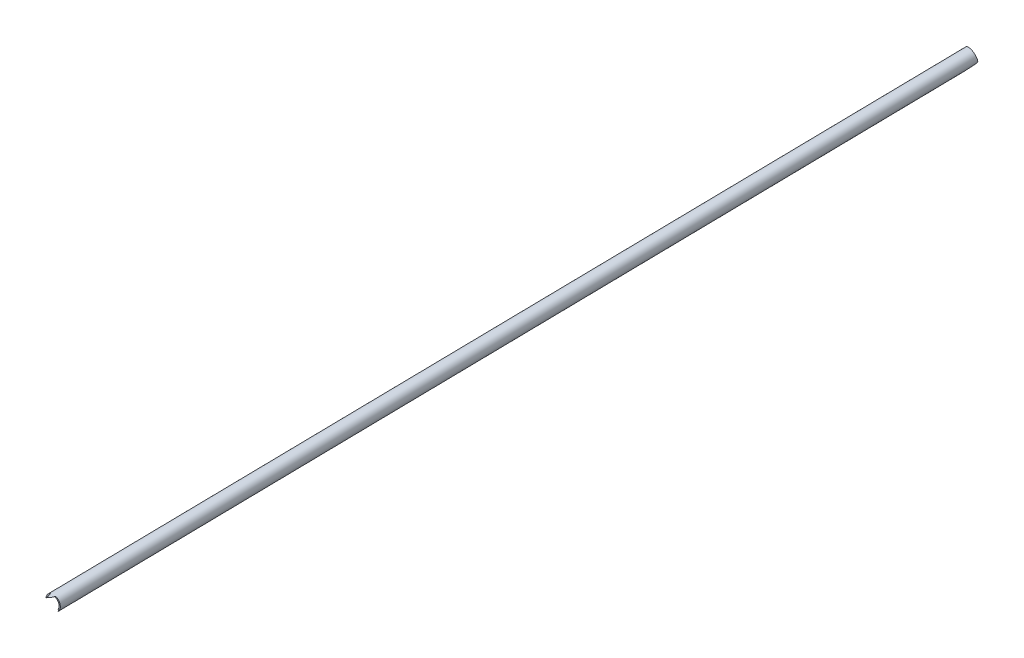
ISO-10303-21;
HEADER;
FILE_DESCRIPTION(('STEP AP214'),'2;1');
FILE_NAME('part.step','',(''),(''),'','','');
FILE_SCHEMA(('AUTOMOTIVE_DESIGN { 1 0 10303 214 1 1 1 1 }'));
ENDSEC;
DATA;
#1=APPLICATION_CONTEXT('core data for automotive mechanical design processes');
#2=APPLICATION_PROTOCOL_DEFINITION('international standard','automotive_design',2000,#1);
#3=PRODUCT_CONTEXT('',#1,'mechanical');
#4=PRODUCT('Part','Part','',(#3));
#5=PRODUCT_RELATED_PRODUCT_CATEGORY('part','',(#4));
#6=PRODUCT_DEFINITION_FORMATION('','',#4);
#7=PRODUCT_DEFINITION_CONTEXT('part definition',#1,'design');
#8=PRODUCT_DEFINITION('design','',#6,#7);
#9=PRODUCT_DEFINITION_SHAPE('','',#8);
#10=(LENGTH_UNIT() NAMED_UNIT(*) SI_UNIT(.MILLI.,.METRE.));
#11=(NAMED_UNIT(*) PLANE_ANGLE_UNIT() SI_UNIT($,.RADIAN.));
#12=(NAMED_UNIT(*) SI_UNIT($,.STERADIAN.) SOLID_ANGLE_UNIT());
#13=UNCERTAINTY_MEASURE_WITH_UNIT(LENGTH_MEASURE(1.E-05),#10,'distance_accuracy_value','');
#14=(GEOMETRIC_REPRESENTATION_CONTEXT(3) GLOBAL_UNCERTAINTY_ASSIGNED_CONTEXT((#13)) GLOBAL_UNIT_ASSIGNED_CONTEXT((#10,
#11,#12)) REPRESENTATION_CONTEXT('',''));
#15=CARTESIAN_POINT('',(0.,0.,0.));
#16=DIRECTION('',(0.,0.,1.));
#17=DIRECTION('',(1.,0.,0.));
#18=AXIS2_PLACEMENT_3D('',#15,#16,#17);
#19=CARTESIAN_POINT('',(325.000000000001,320.,-1580.));
#20=DIRECTION('',(-0.0876619818920292,-0.105194378270435,0.99058039537993));
#21=DIRECTION('',(0.,-0.994408591727349,-0.105600912395825));
#22=AXIS2_PLACEMENT_3D('',#19,#20,#21);
#23=CYLINDRICAL_SURFACE('',#22,7.90000000000002);
#24=CARTESIAN_POINT('',(320.543654947566,306.796558062433,-1530.47754811542));
#25=CARTESIAN_POINT('',(320.488560814158,306.78590810331,-1530.37724688731));
#26=CARTESIAN_POINT('',(320.432764836307,306.77569579562,-1530.27728618767));
#27=CARTESIAN_POINT('',(320.319611164136,306.756248486853,-1530.07814393779));
#28=CARTESIAN_POINT('',(320.262253346996,306.747013562916,-1529.97896244963));
#29=CARTESIAN_POINT('',(320.145784884711,306.729628618284,-1529.78145112065));
#30=CARTESIAN_POINT('',(320.086673163378,306.721479281268,-1529.68312185264));
#31=CARTESIAN_POINT('',(319.966535754802,306.706414140928,-1529.48754429941));
#32=CARTESIAN_POINT('',(319.905510059538,306.699498342775,-1529.39029601873));
#33=CARTESIAN_POINT('',(319.719131630831,306.680834515334,-1529.10030826867));
#34=CARTESIAN_POINT('',(319.590564060701,306.67118353378,-1528.90947424502));
#35=CARTESIAN_POINT('',(319.322561499345,306.659336820871,-1528.5354107769));
#36=CARTESIAN_POINT('',(319.183136461121,306.65713434192,-1528.35217459828));
#37=CARTESIAN_POINT('',(318.96231811265,306.661828444225,-1528.0855588565));
#38=CARTESIAN_POINT('',(318.886345451769,306.664762060353,-1527.99763113501));
#39=CARTESIAN_POINT('',(318.730038087019,306.673991290724,-1527.82595427125));
#40=CARTESIAN_POINT('',(318.649705458901,306.680285317495,-1527.74220317633));
#41=CARTESIAN_POINT('',(318.484307027052,306.697031789688,-1527.58073048478));
#42=CARTESIAN_POINT('',(318.399266260407,306.707463772164,-1527.50298143402));
#43=CARTESIAN_POINT('',(318.223385477481,306.733606206748,-1527.35542462552));
#44=CARTESIAN_POINT('',(318.132554688965,306.749308421845,-1527.2856047016));
#45=CARTESIAN_POINT('',(317.962727321103,306.783757854901,-1527.16984584105));
#46=CARTESIAN_POINT('',(317.884874256616,306.801315252798,-1527.1219046383));
#47=CARTESIAN_POINT('',(317.724966180843,306.841721435934,-1527.03606223227));
#48=CARTESIAN_POINT('',(317.642911007424,306.86457042546,-1526.99816141673));
#49=CARTESIAN_POINT('',(317.474376773763,306.916677734025,-1526.93537934093));
#50=CARTESIAN_POINT('',(317.387853598366,306.946016719098,-1526.91067664911));
#51=CARTESIAN_POINT('',(317.214004180144,307.011013407202,-1526.87864219122));
#52=CARTESIAN_POINT('',(317.126680072444,307.046657342355,-1526.87127306589));
#53=CARTESIAN_POINT('',(316.964656291022,307.118829003525,-1526.87517586683));
#54=CARTESIAN_POINT('',(316.8896518111,307.154793348757,-1526.88441961201));
#55=CARTESIAN_POINT('',(316.744145695094,307.229518976841,-1526.91677961783));
#56=CARTESIAN_POINT('',(316.673649342141,307.268283431899,-1526.93991183642));
#57=CARTESIAN_POINT('',(316.519831995844,307.358162526483,-1527.00580274504));
#58=CARTESIAN_POINT('',(316.438368817278,307.409723417656,-1527.05222334784));
#59=CARTESIAN_POINT('',(316.285243570785,307.513250041039,-1527.15869709257));
#60=CARTESIAN_POINT('',(316.213604036682,307.565216424283,-1527.2187807637));
#61=CARTESIAN_POINT('',(316.086120195484,307.663155638223,-1527.34157670375));
#62=CARTESIAN_POINT('',(316.029407847472,307.709188683477,-1527.40336245114));
#63=CARTESIAN_POINT('',(315.921961502537,307.800550542093,-1527.53246308941));
#64=CARTESIAN_POINT('',(315.871232794217,307.845878702183,-1527.59978278358));
#65=CARTESIAN_POINT('',(315.774761862884,307.935814084267,-1527.73863585102));
#66=CARTESIAN_POINT('',(315.729032323723,307.980419238579,-1527.81017926415));
#67=CARTESIAN_POINT('',(315.641939560466,308.068777951366,-1527.95630687704));
#68=CARTESIAN_POINT('',(315.600574671958,308.112531829237,-1528.03088990254));
#69=CARTESIAN_POINT('',(315.497018737229,308.226151480722,-1528.22942327576));
#70=CARTESIAN_POINT('',(315.437825316874,308.295379158148,-1528.35529865463));
#71=CARTESIAN_POINT('',(315.327042693628,308.432023324735,-1528.61134037376));
#72=CARTESIAN_POINT('',(315.27545795926,308.499438730707,-1528.74150918104));
#73=CARTESIAN_POINT('',(315.178370398651,308.632790738265,-1529.00515956286));
#74=CARTESIAN_POINT('',(315.132879199624,308.698724318415,-1529.13864691025));
#75=CARTESIAN_POINT('',(315.047016508993,308.829194212562,-1529.40794105953));
#76=CARTESIAN_POINT('',(315.006645929395,308.893730275963,-1529.54374826973));
#77=CARTESIAN_POINT('',(314.891545295395,309.086197957968,-1529.95528975568));
#78=CARTESIAN_POINT('',(314.823327453029,309.212278654763,-1530.23371871038));
#79=CARTESIAN_POINT('',(314.730668913138,309.398396406435,-1530.65448403082));
#80=CARTESIAN_POINT('',(314.701409082201,309.45989833005,-1530.79517226639));
#81=CARTESIAN_POINT('',(314.645730994337,309.582033744066,-1531.07748507398));
#82=CARTESIAN_POINT('',(314.61931265223,309.642667260453,-1531.21910961779));
#83=CARTESIAN_POINT('',(314.535788546614,309.842601054816,-1531.69038306624));
#84=CARTESIAN_POINT('',(314.484151237813,309.980209219403,-1532.02172145251));
#85=CARTESIAN_POINT('',(314.391395419461,310.25211594129,-1532.68723863866));
#86=CARTESIAN_POINT('',(314.350278752578,310.3864139151,-1533.02141792554));
#87=CARTESIAN_POINT('',(314.276617125279,310.652355453141,-1533.69197465544));
#88=CARTESIAN_POINT('',(314.244076889045,310.783997517698,-1534.02835320578));
#89=CARTESIAN_POINT('',(314.186204367685,311.04501088905,-1534.70261725784));
#90=CARTESIAN_POINT('',(314.160872463331,311.174382075549,-1535.04050283822));
#91=CARTESIAN_POINT('',(314.11633738783,311.431513169356,-1535.71823087393));
#92=CARTESIAN_POINT('',(314.09714932194,311.559268374798,-1536.05807609242));
#93=CARTESIAN_POINT('',(314.064205806617,311.813128624322,-1536.73864831384));
#94=CARTESIAN_POINT('',(314.050450487851,311.939233628644,-1537.07937533778));
#95=CARTESIAN_POINT('',(314.016392669596,312.315343498669,-1538.10233518503));
#96=CARTESIAN_POINT('',(314.003283353838,312.563234730297,-1538.78558922638));
#97=CARTESIAN_POINT('',(313.9927484289,313.054759676075,-1540.15351922354));
#98=CARTESIAN_POINT('',(313.99531899029,313.298394415194,-1540.83819479136));
#99=CARTESIAN_POINT('',(314.013889159413,313.782598791793,-1542.20849789611));
#100=CARTESIAN_POINT('',(314.029889815062,314.023168188606,-1542.89412550316));
#101=CARTESIAN_POINT('',(314.073766790044,314.501841018603,-1544.26483357784));
#102=CARTESIAN_POINT('',(314.101627377186,314.739947292057,-1544.94991357005));
#103=CARTESIAN_POINT('',(314.168222616848,315.214859084776,-1546.31997107985));
#104=CARTESIAN_POINT('',(314.206956959824,315.451664640873,-1547.0049485998));
#105=CARTESIAN_POINT('',(314.284231365412,315.8683254895,-1548.2108874612));
#106=CARTESIAN_POINT('',(314.320609089683,316.048276902748,-1548.73195570596));
#107=CARTESIAN_POINT('',(314.39920153601,316.408304079174,-1549.7736090704));
#108=CARTESIAN_POINT('',(314.441416252634,316.588379842236,-1550.29419419052));
#109=CARTESIAN_POINT('',(314.531687306014,316.949141882681,-1551.33485938459));
#110=CARTESIAN_POINT('',(314.579745759492,317.129828358099,-1551.85493920634));
#111=CARTESIAN_POINT('',(314.681807012639,317.492219550017,-1552.89415968668));
#112=CARTESIAN_POINT('',(314.735809796608,317.673924263827,-1553.41330034775));
#113=CARTESIAN_POINT('',(314.849934668098,318.038630486234,-1554.44958378193));
#114=CARTESIAN_POINT('',(314.910047602183,318.221629683825,-1554.96672837322));
#115=CARTESIAN_POINT('',(315.036894450987,318.589835459905,-1555.99941595813));
#116=CARTESIAN_POINT('',(315.103628309615,318.775042019682,-1556.5149589653));
#117=CARTESIAN_POINT('',(315.244370796393,319.148408306645,-1557.54385252987));
#118=CARTESIAN_POINT('',(315.318377798014,319.336567365675,-1558.0572035508));
#119=CARTESIAN_POINT('',(315.474665115471,319.716843990279,-1559.08116255843));
#120=CARTESIAN_POINT('',(315.55694515178,319.908961421933,-1559.59177063719));
#121=CARTESIAN_POINT('',(315.730728841968,320.297270781887,-1560.60645441873));
#122=CARTESIAN_POINT('',(315.822177183444,320.493433203887,-1561.11055077089));
#123=CARTESIAN_POINT('',(316.016789343097,320.89242962909,-1562.11392573019));
#124=CARTESIAN_POINT('',(316.119954814866,321.095264571082,-1562.6132036465));
#125=CARTESIAN_POINT('',(316.341173052316,321.50968872199,-1563.60539780196));
#126=CARTESIAN_POINT('',(316.459238487067,321.721285276585,-1564.09830822912));
#127=CARTESIAN_POINT('',(316.651011995122,322.046864303911,-1564.83012627012));
#128=CARTESIAN_POINT('',(316.717375533344,322.156744074798,-1565.07278545712));
#129=CARTESIAN_POINT('',(316.855843203145,322.379574395132,-1565.55502883536));
#130=CARTESIAN_POINT('',(316.927947011535,322.492524771462,-1565.79461319883));
#131=CARTESIAN_POINT('',(317.098149289079,322.75108769904,-1566.33065265765));
#132=CARTESIAN_POINT('',(317.198187223599,322.897683065161,-1566.62602704167));
#133=CARTESIAN_POINT('',(317.411410729602,323.196832795408,-1567.20887615008));
#134=CARTESIAN_POINT('',(317.524593047775,323.349385678836,-1567.49635280752));
#135=CARTESIAN_POINT('',(317.767257292476,323.660608189947,-1568.06037322411));
#136=CARTESIAN_POINT('',(317.896714172772,323.819268164031,-1568.33693294272));
#137=CARTESIAN_POINT('',(318.176182644987,324.142634735303,-1568.87577884827));
#138=CARTESIAN_POINT('',(318.326182817154,324.307337936159,-1569.13807285294));
#139=CARTESIAN_POINT('',(318.592904342085,324.580991636479,-1569.55229016032));
#140=CARTESIAN_POINT('',(318.702123260868,324.688631581438,-1569.70990863895));
#141=CARTESIAN_POINT('',(318.932234960658,324.904821484434,-1570.01567971377));
#142=CARTESIAN_POINT('',(319.053123503814,325.013371099144,-1570.16383571404));
#143=CARTESIAN_POINT('',(319.307603390287,325.229932490588,-1570.44887036527));
#144=CARTESIAN_POINT('',(319.441178883807,325.337944765522,-1570.58576269887));
#145=CARTESIAN_POINT('',(319.721978163475,325.551667920021,-1570.84682058821));
#146=CARTESIAN_POINT('',(319.869201442168,325.657378884974,-1570.97098661678));
#147=CARTESIAN_POINT('',(320.179554564179,325.865419780353,-1571.20671306965));
#148=CARTESIAN_POINT('',(320.342863933022,325.967689092507,-1571.3180917435));
#149=CARTESIAN_POINT('',(320.683331622106,326.164532669489,-1571.52548402261));
#150=CARTESIAN_POINT('',(320.860490035775,326.259106882398,-1571.6214975242));
#151=CARTESIAN_POINT('',(321.227480589281,326.437629035614,-1571.79801253723));
#152=CARTESIAN_POINT('',(321.41731431635,326.521575641282,-1571.87851210106));
#153=CARTESIAN_POINT('',(321.807833492552,326.676125782724,-1572.02458045477));
#154=CARTESIAN_POINT('',(322.008517951737,326.746730533086,-1572.09015060387));
#155=CARTESIAN_POINT('',(322.386852999763,326.862669615387,-1572.19849017533));
#156=CARTESIAN_POINT('',(322.56327262817,326.910222812339,-1572.24321708883));
#157=CARTESIAN_POINT('',(322.920904422984,326.993187165938,-1572.32379372898));
#158=CARTESIAN_POINT('',(323.102115961647,327.028599904592,-1572.35964461209));
#159=CARTESIAN_POINT('',(323.467984258053,327.086543094326,-1572.42347648955));
#160=CARTESIAN_POINT('',(323.652641768979,327.109070694233,-1572.4514557414));
#161=CARTESIAN_POINT('',(324.024012262607,327.140733670167,-1572.5005199512));
#162=CARTESIAN_POINT('',(324.210725359054,327.149868301306,-1572.52160452564));
#163=CARTESIAN_POINT('',(324.589494766305,327.154507921747,-1572.55823049584));
#164=CARTESIAN_POINT('',(324.781569606189,327.149672377419,-1572.57362290236));
#165=CARTESIAN_POINT('',(325.16515932435,327.12550881736,-1572.59897571592));
#166=CARTESIAN_POINT('',(325.356674201621,327.106180775596,-1572.6089361132));
#167=CARTESIAN_POINT('',(325.737887405151,327.053060098952,-1572.624133528));
#168=CARTESIAN_POINT('',(325.927585605462,327.019266468507,-1572.62937022035));
#169=CARTESIAN_POINT('',(326.303940551276,326.937372486669,-1572.63567184936));
#170=CARTESIAN_POINT('',(326.490597186519,326.889271617835,-1572.63673663513));
#171=CARTESIAN_POINT('',(326.870441484906,326.7758216514,-1572.63504248807));
#172=CARTESIAN_POINT('',(327.063377657455,326.709632138098,-1572.63205757823));
#173=CARTESIAN_POINT('',(327.443209242765,326.561968799258,-1572.62213821247));
#174=CARTESIAN_POINT('',(327.630104423664,326.480494387873,-1572.61520360514));
#175=CARTESIAN_POINT('',(327.996613299343,326.302796984137,-1572.59746464312));
#176=CARTESIAN_POINT('',(328.176225221308,326.206570427899,-1572.58665935248));
#177=CARTESIAN_POINT('',(328.52687960532,326.000058800123,-1572.56106677425));
#178=CARTESIAN_POINT('',(328.697922057972,325.889773713172,-1572.5462794823));
#179=CARTESIAN_POINT('',(329.033019298696,325.653990813228,-1572.51213164114));
#180=CARTESIAN_POINT('',(329.196909833362,325.528269834622,-1572.49269888839));
#181=CARTESIAN_POINT('',(329.513395759784,325.264107705259,-1572.44886527564));
#182=CARTESIAN_POINT('',(329.665990933439,325.125666309,-1572.42446431975));
#183=CARTESIAN_POINT('',(329.95873851075,324.837227209316,-1572.36995252232));
#184=CARTESIAN_POINT('',(330.098891013491,324.687229597933,-1572.33984172625));
#185=CARTESIAN_POINT('',(330.365689534809,324.37704507744,-1572.27297052797));
#186=CARTESIAN_POINT('',(330.492335937472,324.21685845829,-1572.23621031495));
#187=CARTESIAN_POINT('',(330.728620674935,323.891427890684,-1572.15580204699));
#188=CARTESIAN_POINT('',(330.838565266961,323.726365819843,-1572.11231843372));
#189=CARTESIAN_POINT('',(331.043893895243,323.389782103441,-1572.01677769331));
#190=CARTESIAN_POINT('',(331.139278215232,323.218260583835,-1571.96472073328));
#191=CARTESIAN_POINT('',(331.314908555404,322.870940096549,-1571.85092985606));
#192=CARTESIAN_POINT('',(331.395168440676,322.695145215004,-1571.78920489786));
#193=CARTESIAN_POINT('',(331.540469365751,322.341385035346,-1571.65500545517));
#194=CARTESIAN_POINT('',(331.605511508222,322.163419895473,-1571.58253175016));
#195=CARTESIAN_POINT('',(331.716864457431,321.819239570251,-1571.43113807847));
#196=CARTESIAN_POINT('',(331.764115801131,321.653010117936,-1571.35293993579));
#197=CARTESIAN_POINT('',(331.846026585465,321.322689603453,-1571.18616576613));
#198=CARTESIAN_POINT('',(331.880687053074,321.158598367934,-1571.09759058633));
#199=CARTESIAN_POINT('',(331.938274419082,320.834337141683,-1570.91013105344));
#200=CARTESIAN_POINT('',(331.961202933524,320.67416661378,-1570.81124812248));
#201=CARTESIAN_POINT('',(331.996468023562,320.359166396229,-1570.60359301724));
#202=CARTESIAN_POINT('',(332.008803192386,320.204337418547,-1570.49481953164));
#203=CARTESIAN_POINT('',(332.026580168547,319.853677307344,-1570.23265802394));
#204=CARTESIAN_POINT('',(332.028663350103,319.660152421696,-1570.07595012022));
#205=CARTESIAN_POINT('',(332.019860436871,319.285377779221,-1569.7488435511));
#206=CARTESIAN_POINT('',(332.008969454362,319.104132675716,-1569.57843974864));
#207=CARTESIAN_POINT('',(331.977009511533,318.753748866412,-1569.22591533437));
#208=CARTESIAN_POINT('',(331.955920319097,318.584634996766,-1569.04377205797));
#209=CARTESIAN_POINT('',(331.905947739692,318.258333609715,-1568.67023761511));
#210=CARTESIAN_POINT('',(331.877065228041,318.101144755474,-1568.47884748921));
#211=CARTESIAN_POINT('',(331.804740912746,317.756316507011,-1568.03546753412));
#212=CARTESIAN_POINT('',(331.759476202483,317.57204190672,-1567.78116853163));
#213=CARTESIAN_POINT('',(331.662268536929,317.218669089389,-1567.2633948974));
#214=CARTESIAN_POINT('',(331.610322261505,317.049578488845,-1566.99991575175));
#215=CARTESIAN_POINT('',(331.5016037673,316.724034537327,-1566.46555987426));
#216=CARTESIAN_POINT('',(331.444822346884,316.567606439091,-1566.19466973475));
#217=CARTESIAN_POINT('',(331.327849916855,316.265743150107,-1565.64765165932));
#218=CARTESIAN_POINT('',(331.267659455125,316.12030620164,-1565.37152456977));
#219=CARTESIAN_POINT('',(331.144113473533,315.837245164978,-1564.81233723308));
#220=CARTESIAN_POINT('',(331.080731942574,315.699715842018,-1564.52923500289));
#221=CARTESIAN_POINT('',(330.951981411081,315.432635518018,-1563.95974292152));
#222=CARTESIAN_POINT('',(330.886612344831,315.303084781212,-1563.67335296182));
#223=CARTESIAN_POINT('',(330.754391561077,315.050971942088,-1563.09840729203));
#224=CARTESIAN_POINT('',(330.68754226103,314.928399466186,-1562.80985555868));
#225=CARTESIAN_POINT('',(330.552532438082,314.68907356205,-1562.23067494421));
#226=CARTESIAN_POINT('',(330.484371967602,314.572319901844,-1561.94004614644));
#227=CARTESIAN_POINT('',(330.3400029885,314.33235488977,-1561.32779207901));
#228=CARTESIAN_POINT('',(330.263674195375,314.209674098626,-1561.00598759943));
#229=CARTESIAN_POINT('',(330.109779921367,313.96955503906,-1560.36071989023));
#230=CARTESIAN_POINT('',(330.032214409086,313.852116904027,-1560.03725661865));
#231=CARTESIAN_POINT('',(329.797780844003,313.506581698846,-1559.06479110977));
#232=CARTESIAN_POINT('',(329.639192095848,313.285290583662,-1558.41378240259));
#233=CARTESIAN_POINT('',(329.317573028748,312.856699910225,-1557.10787740288));
#234=CARTESIAN_POINT('',(329.154540248071,312.649408337429,-1556.45297911956));
#235=CARTESIAN_POINT('',(328.823977591398,312.246281498985,-1555.14078558311));
#236=CARTESIAN_POINT('',(328.656447601909,312.050446522856,-1554.48349026985));
#237=CARTESIAN_POINT('',(328.315681840023,311.667399978086,-1553.16386188555));
#238=CARTESIAN_POINT('',(328.142420523519,311.480239640035,-1552.50152058244));
#239=CARTESIAN_POINT('',(327.790587930462,311.11440391,-1551.17589676297));
#240=CARTESIAN_POINT('',(327.612016571257,310.935728650197,-1550.51261423213));
#241=CARTESIAN_POINT('',(327.24912182341,310.586166314009,-1549.18608746083));
#242=CARTESIAN_POINT('',(327.06480242843,310.415274024641,-1548.52284350099));
#243=CARTESIAN_POINT('',(326.689602770863,310.080666135584,-1547.19640938043));
#244=CARTESIAN_POINT('',(326.498722592983,309.916950443298,-1546.53321921912));
#245=CARTESIAN_POINT('',(326.112142909169,309.598631220125,-1545.21619227871));
#246=CARTESIAN_POINT('',(325.916541949598,309.44393512934,-1544.56234898694));
#247=CARTESIAN_POINT('',(325.517085303219,309.141384361079,-1543.25560394804));
#248=CARTESIAN_POINT('',(325.313229700178,308.993529614211,-1542.60270219144));
#249=CARTESIAN_POINT('',(324.895597184618,308.704745580556,-1541.2973088359));
#250=CARTESIAN_POINT('',(324.681804677592,308.563827946617,-1540.64481963046));
#251=CARTESIAN_POINT('',(324.242856048083,308.289846050513,-1539.34208588844));
#252=CARTESIAN_POINT('',(324.01770111563,308.156780969074,-1538.69184112437));
#253=CARTESIAN_POINT('',(323.555416801601,307.900609630553,-1537.39964551038));
#254=CARTESIAN_POINT('',(323.318397074067,307.777432496547,-1536.75766985088));
#255=CARTESIAN_POINT('',(322.949959410174,307.600612580567,-1535.79802894267));
#256=CARTESIAN_POINT('',(322.824964579778,307.542984282258,-1535.47862764204));
#257=CARTESIAN_POINT('',(322.570057789211,307.430734297433,-1534.84126598101));
#258=CARTESIAN_POINT('',(322.440145972318,307.376112523423,-1534.52330557892));
#259=CARTESIAN_POINT('',(322.174972374082,307.270448905713,-1533.89000029845));
#260=CARTESIAN_POINT('',(322.03972518513,307.219398230627,-1533.57465080073));
#261=CARTESIAN_POINT('',(321.762567033753,307.121321147878,-1532.9462740703));
#262=CARTESIAN_POINT('',(321.62065652734,307.074294465447,-1532.63324668038));
#263=CARTESIAN_POINT('',(321.328904987743,306.985129111191,-1532.01047547831));
#264=CARTESIAN_POINT('',(321.179069812119,306.942986900531,-1531.70072943853));
#265=CARTESIAN_POINT('',(320.869499851362,306.864757293392,-1531.08547377847));
#266=CARTESIAN_POINT('',(320.709767505267,306.828668413207,-1530.77996313696));
#267=CARTESIAN_POINT('',(320.543654947566,306.796558062433,-1530.47754811542));
#268=B_SPLINE_CURVE_WITH_KNOTS('',3,(#24,#25,#26,#27,#28,#29,#30,#31,#32,#33,#34,#35,#36,#37,
#38,#39,#40,#41,#42,#43,#44,#45,#46,#47,#48,#49,#50,#51,#52,#53,#54,#55,#56,#57,#58,#59,#60,#61,
#62,#63,#64,#65,#66,#67,#68,#69,#70,#71,#72,#73,#74,#75,#76,#77,#78,#79,#80,#81,#82,#83,#84,#85,
#86,#87,#88,#89,#90,#91,#92,#93,#94,#95,#96,#97,#98,#99,#100,#101,#102,#103,#104,#105,#106,#107,
#108,#109,#110,#111,#112,#113,#114,#115,#116,#117,#118,#119,#120,#121,#122,#123,#124,#125,#126,
#127,#128,#129,#130,#131,#132,#133,#134,#135,#136,#137,#138,#139,#140,#141,#142,#143,#144,#145,
#146,#147,#148,#149,#150,#151,#152,#153,#154,#155,#156,#157,#158,#159,#160,#161,#162,#163,#164,
#165,#166,#167,#168,#169,#170,#171,#172,#173,#174,#175,#176,#177,#178,#179,#180,#181,#182,#183,
#184,#185,#186,#187,#188,#189,#190,#191,#192,#193,#194,#195,#196,#197,#198,#199,#200,#201,#202,
#203,#204,#205,#206,#207,#208,#209,#210,#211,#212,#213,#214,#215,#216,#217,#218,#219,#220,#221,
#222,#223,#224,#225,#226,#227,#228,#229,#230,#231,#232,#233,#234,#235,#236,#237,#238,#239,#240,
#241,#242,#243,#244,#245,#246,#247,#248,#249,#250,#251,#252,#253,#254,#255,#256,#257,#258,#259,
#260,#261,#262,#263,#264,#265,#266,#267),.UNSPECIFIED.,.T.,.F.,(4,2,2,2,2,2,2,2,2,2,2,2,2,2,2,2,
2,2,2,2,2,2,2,2,2,2,2,2,2,2,2,2,2,2,2,2,2,2,2,2,2,2,2,2,2,2,2,2,2,2,2,2,2,2,2,2,2,2,2,2,2,2,2,2,
2,2,2,2,2,2,2,2,2,2,2,2,2,2,2,2,2,2,2,2,2,2,2,2,2,2,2,2,2,2,2,2,2,2,2,2,2,2,2,2,2,2,2,2,2,2,2,2,
2,2,2,2,2,2,2,2,2,4),(0.,0.344786037196059,0.68959926628695,1.03462863438675,1.37965944854352,
2.07023732650786,2.76018944226897,3.10875559039596,3.45715721997359,3.80385700053645,
4.1500174170313,4.42871553035893,4.70742440494515,4.98981435328882,5.27159510328553,
5.52127161457787,5.7712355565361,6.09045023472007,6.41038530946563,6.69697776967708,
6.98382166437584,7.27137722580638,7.5588227317163,8.02457103273437,8.49059178432291,
8.95748946467793,9.42447018517034,10.3634303084531,10.8323359117984,11.3012274546858,
12.3883892785765,13.4757413863737,14.5636911977893,15.6516984681382,16.7423605341283,
17.8330488311457,20.013647016733,22.1937126654252,24.3739484346918,26.5513010908421,
28.7285917705539,30.3859585744859,32.0433238359269,33.7012912275468,35.3592542399097,
37.0147691227241,38.6702699815901,40.3254014517192,41.9804770172512,43.6261081461517,
45.2719718055067,46.9192444514816,47.7427275502677,48.5661643178254,49.5996250378272,
50.63283051331,51.6644649371858,52.6955281990019,53.3548189598258,54.0138711919972,
54.6721106375321,55.3303256181177,55.9969680585236,56.6636149965681,57.3303455708245,
57.9970154193452,58.5606966612961,59.1243044227266,59.6880368488399,60.2518006273163,
60.8294216435613,61.4070436973591,61.9847055112377,62.5623882195554,63.1736671706393,
63.784969555897,64.3964198556425,65.0078708257705,65.6295261596348,66.2511934938689,
66.8728558772225,67.4945005770861,68.1028268640392,68.7111412952017,69.3188953214791,
69.926605296632,70.4949438664378,71.0632360692623,71.6314499702943,72.1997393170915,
72.9456130132245,73.6917677892008,74.439408964543,75.1869662024976,76.1381015512328,
77.0897113675864,78.0431744708114,78.9964847708386,79.9595137771316,80.922574659917,
81.8841643618192,82.845715698175,83.9039208940497,84.9621529983167,87.0788450919644,
89.1967345414745,91.3146774891243,93.4438505868775,95.5730568425781,97.7008153410094,
99.8285463782435,101.927831625065,104.027095574103,106.129773249581,108.23223115875,
110.317943875784,111.361291333139,112.404608411405,113.445246778113,114.48581403104,
115.525622609655,116.565175951449),.UNSPECIFIED.);
#269=CARTESIAN_POINT('',(320.543654947566,306.796558062433,-1530.47754811542));
#270=VERTEX_POINT('',#269);
#271=EDGE_CURVE('E122',#270,#270,#268,.T.);
#272=ORIENTED_EDGE('',*,*,#271,.T.);
#273=EDGE_LOOP('',(#272));
#274=FACE_BOUND('',#273,.T.);
#275=CARTESIAN_POINT('',(227.132676253428,194.703383629466,-474.933488871653));
#276=CARTESIAN_POINT('',(227.258458717553,194.686329876106,-474.77290976023));
#277=CARTESIAN_POINT('',(227.37959929058,194.672554963167,-474.608358444933));
#278=CARTESIAN_POINT('',(227.613822176292,194.650561283138,-474.273217818518));
#279=CARTESIAN_POINT('',(227.726901185122,194.642344782463,-474.102626074243));
#280=CARTESIAN_POINT('',(227.94612274839,194.630700236803,-473.756570001234));
#281=CARTESIAN_POINT('',(228.052255280463,194.62727897125,-473.581099130928));
#282=CARTESIAN_POINT('',(228.25827316125,194.624648176384,-473.226476699128));
#283=CARTESIAN_POINT('',(228.358157439982,194.625439366447,-473.047324514167));
#284=CARTESIAN_POINT('',(228.552887204009,194.630782077004,-472.68513037813));
#285=CARTESIAN_POINT('',(228.647702830305,194.635353718736,-472.502072730865));
#286=CARTESIAN_POINT('',(228.832315210354,194.647914782998,-472.133552286181));
#287=CARTESIAN_POINT('',(228.922111511709,194.655904513046,-471.948089273813));
#288=CARTESIAN_POINT('',(229.18456854676,194.68452898913,-471.389137467985));
#289=CARTESIAN_POINT('',(229.350494665127,194.709825800467,-471.012712990457));
#290=CARTESIAN_POINT('',(229.679068940281,194.77345654576,-470.2269240051));
#291=CARTESIAN_POINT('',(229.840592455818,194.812607766643,-469.817161745957));
#292=CARTESIAN_POINT('',(230.14940325783,194.902225247805,-468.993466111648));
#293=CARTESIAN_POINT('',(230.296687563272,194.952693870115,-468.579531883007));
#294=CARTESIAN_POINT('',(230.579329666679,195.06454939242,-467.748382136189));
#295=CARTESIAN_POINT('',(230.714668912048,195.125952844679,-467.33116257309));
#296=CARTESIAN_POINT('',(230.974829682494,195.259702132825,-466.495257062945));
#297=CARTESIAN_POINT('',(231.099652227896,195.332046905286,-466.076571262268));
#298=CARTESIAN_POINT('',(231.33977094657,195.488092153472,-465.240025342462));
#299=CARTESIAN_POINT('',(231.45509530315,195.571756932034,-464.822166657306));
#300=CARTESIAN_POINT('',(231.677755608385,195.751932925387,-463.98702002658));
#301=CARTESIAN_POINT('',(231.785090425866,195.848445953883,-463.569732170009));
#302=CARTESIAN_POINT('',(231.992496001758,196.056317368734,-462.737734763409));
#303=CARTESIAN_POINT('',(232.092577892093,196.16765222765,-462.323022195491));
#304=CARTESIAN_POINT('',(232.237853615255,196.348446922002,-461.703916344414));
#305=CARTESIAN_POINT('',(232.285465667792,196.411002353265,-461.498065694961));
#306=CARTESIAN_POINT('',(232.379123804523,196.541330159838,-461.087668365834));
#307=CARTESIAN_POINT('',(232.425169959384,196.609102299274,-460.883121627656));
#308=CARTESIAN_POINT('',(232.528986830824,196.771325668643,-460.416019521788));
#309=CARTESIAN_POINT('',(232.586237926673,196.86777407725,-460.154035465103));
#310=CARTESIAN_POINT('',(232.698062784299,197.072637435985,-459.634091979816));
#311=CARTESIAN_POINT('',(232.75263594168,197.18105506972,-459.376133468637));
#312=CARTESIAN_POINT('',(232.858631037939,197.412232736203,-458.866569916755));
#313=CARTESIAN_POINT('',(232.910058381286,197.53496705427,-458.614954442642));
#314=CARTESIAN_POINT('',(233.009049134101,197.79812361458,-458.120343638508));
#315=CARTESIAN_POINT('',(233.056614412111,197.938537218345,-457.877344172339));
#316=CARTESIAN_POINT('',(233.130407339524,198.187205815407,-457.487741895955));
#317=CARTESIAN_POINT('',(233.158226393069,198.289241114459,-457.337475132726));
#318=CARTESIAN_POINT('',(233.210893157937,198.503174689762,-457.043615806582));
#319=CARTESIAN_POINT('',(233.23574194909,198.615069355817,-456.90002082984));
#320=CARTESIAN_POINT('',(233.281522687657,198.849336024458,-456.621335136889));
#321=CARTESIAN_POINT('',(233.302461015814,198.971690475532,-456.486230809743));
#322=CARTESIAN_POINT('',(233.339297712061,199.227407723235,-456.226078025968));
#323=CARTESIAN_POINT('',(233.355196365429,199.360769896219,-456.101029000444));
#324=CARTESIAN_POINT('',(233.380750562594,199.640134271899,-455.861113184994));
#325=CARTESIAN_POINT('',(233.390318975223,199.786282744242,-455.746406547208));
#326=CARTESIAN_POINT('',(233.401354467267,200.088567473371,-455.530535077926));
#327=CARTESIAN_POINT('',(233.402821753109,200.244703475557,-455.429369901437));
#328=CARTESIAN_POINT('',(233.396255300233,200.565205446913,-455.241256773237));
#329=CARTESIAN_POINT('',(233.388217838015,200.729574617276,-455.154314408526));
#330=CARTESIAN_POINT('',(233.361513825507,201.064193622415,-454.994557072427));
#331=CARTESIAN_POINT('',(233.342847366288,201.234443406794,-454.921741980003));
#332=CARTESIAN_POINT('',(233.297872981354,201.552007711166,-454.799506927473));
#333=CARTESIAN_POINT('',(233.273174709298,201.698838196219,-454.748211750103));
#334=CARTESIAN_POINT('',(233.215348310462,201.99365359305,-454.654268591797));
#335=CARTESIAN_POINT('',(233.182217099651,202.141638907931,-454.611623784684));
#336=CARTESIAN_POINT('',(233.107396408212,202.437513659359,-454.534053992346));
#337=CARTESIAN_POINT('',(233.065703818354,202.585403041438,-454.499131821342));
#338=CARTESIAN_POINT('',(232.973775745671,202.879910669333,-454.436064418599));
#339=CARTESIAN_POINT('',(232.923542286126,203.026529207579,-454.40791758563));
#340=CARTESIAN_POINT('',(232.806598762137,203.338975486293,-454.353753795021));
#341=CARTESIAN_POINT('',(232.738552456944,203.504463220986,-454.328656183946));
#342=CARTESIAN_POINT('',(232.59152755269,203.831372740691,-454.284860361));
#343=CARTESIAN_POINT('',(232.512548286096,203.992794276723,-454.266162540122));
#344=CARTESIAN_POINT('',(232.343927874477,204.310569789207,-454.23404980795));
#345=CARTESIAN_POINT('',(232.254283576477,204.466922249585,-454.22063646402));
#346=CARTESIAN_POINT('',(232.064707036748,204.773591161366,-454.198150600985));
#347=CARTESIAN_POINT('',(231.964773928397,204.923907102832,-454.189078447901));
#348=CARTESIAN_POINT('',(231.737105180225,205.242770040533,-454.17322693224));
#349=CARTESIAN_POINT('',(231.607536336137,205.410044975276,-454.167103969263));
#350=CARTESIAN_POINT('',(231.335602074397,205.733964791662,-454.158660814289));
#351=CARTESIAN_POINT('',(231.193235382185,205.890608611801,-454.156341001499));
#352=CARTESIAN_POINT('',(230.896503669416,206.192211587921,-454.154674600654));
#353=CARTESIAN_POINT('',(230.742134598643,206.337166765649,-454.155329020575));
#354=CARTESIAN_POINT('',(230.422379044848,206.614331785844,-454.158968896078));
#355=CARTESIAN_POINT('',(230.256992548727,206.74654161316,-454.161954354432));
#356=CARTESIAN_POINT('',(229.908043036978,207.003335582786,-454.169962444538));
#357=CARTESIAN_POINT('',(229.723988714289,207.127250096379,-454.175075894576));
#358=CARTESIAN_POINT('',(229.346165625395,207.359181650498,-454.186952578237));
#359=CARTESIAN_POINT('',(229.152396477183,207.467198065219,-454.193715876774));
#360=CARTESIAN_POINT('',(228.756512783038,207.666541570732,-454.208675191588));
#361=CARTESIAN_POINT('',(228.554398412419,207.757869011904,-454.216871177778));
#362=CARTESIAN_POINT('',(228.143260434539,207.923186291382,-454.234636281135));
#363=CARTESIAN_POINT('',(227.934236897665,207.997176306253,-454.244205384317));
#364=CARTESIAN_POINT('',(227.510732113031,208.127327596632,-454.264817575798));
#365=CARTESIAN_POINT('',(227.29624968521,208.183484981246,-454.275860985031));
#366=CARTESIAN_POINT('',(226.863419954044,208.27758936659,-454.29968408447));
#367=CARTESIAN_POINT('',(226.645072622485,208.315536234322,-454.312463787356));
#368=CARTESIAN_POINT('',(226.206047232573,208.373015894289,-454.340206135285));
#369=CARTESIAN_POINT('',(225.985368588524,208.392543942285,-454.355169341601));
#370=CARTESIAN_POINT('',(225.543361307801,208.413109708903,-454.387920994379));
#371=CARTESIAN_POINT('',(225.322032677015,208.414147594465,-454.405709415334));
#372=CARTESIAN_POINT('',(224.879951341341,208.397814167254,-454.445026618906));
#373=CARTESIAN_POINT('',(224.659200594227,208.380407040751,-454.466562610013));
#374=CARTESIAN_POINT('',(224.220407644313,208.327390376024,-454.514508247523));
#375=CARTESIAN_POINT('',(224.002365625336,208.291779609273,-454.540918222785));
#376=CARTESIAN_POINT('',(223.570857783788,208.202829426559,-454.6000774168));
#377=CARTESIAN_POINT('',(223.357390755251,208.14949474535,-454.632824941568));
#378=CARTESIAN_POINT('',(222.936906725982,208.025803962309,-454.706495585605));
#379=CARTESIAN_POINT('',(222.729888316032,207.955451609229,-454.747416903955));
#380=CARTESIAN_POINT('',(222.365822297394,207.814804604406,-454.830220775459));
#381=CARTESIAN_POINT('',(222.207205944186,207.747434278798,-454.870199130868));
#382=CARTESIAN_POINT('',(221.896532366017,207.603350783135,-454.957992588756));
#383=CARTESIAN_POINT('',(221.744473751803,207.526639605231,-455.005806020977));
#384=CARTESIAN_POINT('',(221.448340187644,207.364976503362,-455.110522473072));
#385=CARTESIAN_POINT('',(221.304254332222,207.280036296313,-455.16741264161));
#386=CARTESIAN_POINT('',(221.025132665087,207.10312663228,-455.291594010166));
#387=CARTESIAN_POINT('',(220.890096835919,207.011157188854,-455.358885190122));
#388=CARTESIAN_POINT('',(220.629271575447,206.821034037713,-455.505502047505));
#389=CARTESIAN_POINT('',(220.503568215871,206.722835326646,-455.584922998385));
#390=CARTESIAN_POINT('',(220.263798819452,206.522917849822,-455.755961316011));
#391=CARTESIAN_POINT('',(220.14973181487,206.421199377729,-455.847577667061));
#392=CARTESIAN_POINT('',(219.934044804809,206.21637918532,-456.042889617746));
#393=CARTESIAN_POINT('',(219.832416708439,206.113278413073,-456.146577279018));
#394=CARTESIAN_POINT('',(219.641727802679,205.907562451919,-456.365349860119));
#395=CARTESIAN_POINT('',(219.552668338653,205.804947316129,-456.480435997818));
#396=CARTESIAN_POINT('',(219.376784220682,205.589549827079,-456.735217438799));
#397=CARTESIAN_POINT('',(219.291518291313,205.477030027048,-456.876207557341));
#398=CARTESIAN_POINT('',(219.135145111771,205.256036363668,-457.168770573596));
#399=CARTESIAN_POINT('',(219.064041127047,205.147563438118,-457.32034590118));
#400=CARTESIAN_POINT('',(218.934213218572,204.935031028892,-457.632393839273));
#401=CARTESIAN_POINT('',(218.875529532619,204.830986736615,-457.792893303163));
#402=CARTESIAN_POINT('',(218.769150414745,204.627801216854,-458.120425974531));
#403=CARTESIAN_POINT('',(218.721454521161,204.528659783509,-458.287458907153));
#404=CARTESIAN_POINT('',(218.62511608723,204.311704740393,-458.66735335271));
#405=CARTESIAN_POINT('',(218.579010749339,204.195142924837,-458.881565788609));
#406=CARTESIAN_POINT('',(218.498727294328,203.968292193846,-459.315527911651));
#407=CARTESIAN_POINT('',(218.464554808927,203.858006260815,-459.535280160998));
#408=CARTESIAN_POINT('',(218.406117562807,203.642604467607,-459.979049257365));
#409=CARTESIAN_POINT('',(218.381870293867,203.537498019743,-460.203072911378));
#410=CARTESIAN_POINT('',(218.341842376995,203.331755615131,-460.653842856786));
#411=CARTESIAN_POINT('',(218.326060424335,203.231118971663,-460.880588723104));
#412=CARTESIAN_POINT('',(218.301742773852,203.032940995455,-461.337256720622));
#413=CARTESIAN_POINT('',(218.293246623227,202.935419287837,-461.56718938754));
#414=CARTESIAN_POINT('',(218.282776410524,202.743319219197,-462.028424739365));
#415=CARTESIAN_POINT('',(218.280802521985,202.648740936557,-462.259727460562));
#416=CARTESIAN_POINT('',(218.282736434891,202.462009383258,-462.723008172193));
#417=CARTESIAN_POINT('',(218.286638321263,202.36985376872,-462.954985249201));
#418=CARTESIAN_POINT('',(218.299851617544,202.187347034046,-463.419496874994));
#419=CARTESIAN_POINT('',(218.309163194783,202.096995969817,-463.652031440801));
#420=CARTESIAN_POINT('',(218.337260977333,201.884384590577,-464.203683357259));
#421=CARTESIAN_POINT('',(218.358280570544,201.762721347608,-464.522918115483));
#422=CARTESIAN_POINT('',(218.409341746737,201.5209822547,-465.161272155019));
#423=CARTESIAN_POINT('',(218.439383665977,201.400906464098,-465.480391431582));
#424=CARTESIAN_POINT('',(218.508294452954,201.161472591394,-466.118165230416));
#425=CARTESIAN_POINT('',(218.547168583558,201.042114980941,-466.436819361117));
#426=CARTESIAN_POINT('',(218.633761900838,200.803497911181,-467.072954238425));
#427=CARTESIAN_POINT('',(218.681480900196,200.68423844985,-467.390435009736));
#428=CARTESIAN_POINT('',(218.785889673825,200.445493669217,-468.022899576345));
#429=CARTESIAN_POINT('',(218.842556481731,200.326009681542,-468.337887653427));
#430=CARTESIAN_POINT('',(218.96543228533,200.085930968016,-468.965595323973));
#431=CARTESIAN_POINT('',(219.031641691803,199.965336194558,-469.278314819173));
#432=CARTESIAN_POINT('',(219.174287456225,199.722552770323,-469.900545319413));
#433=CARTESIAN_POINT('',(219.250716813481,199.600365261829,-470.210058365874));
#434=CARTESIAN_POINT('',(219.414863908673,199.353743837146,-470.825143766403));
#435=CARTESIAN_POINT('',(219.502580248064,199.229310200908,-471.130716603539));
#436=CARTESIAN_POINT('',(219.691087947193,198.977075357642,-471.737879731695));
#437=CARTESIAN_POINT('',(219.791926976563,198.849263297212,-472.03945085578));
#438=CARTESIAN_POINT('',(220.008440690454,198.589958715704,-472.635793095585));
#439=CARTESIAN_POINT('',(220.124120836615,198.458464853692,-472.930561660557));
#440=CARTESIAN_POINT('',(220.372580714325,198.191487134399,-473.509585880678));
#441=CARTESIAN_POINT('',(220.505295592949,198.056019840472,-473.793876398581));
#442=CARTESIAN_POINT('',(220.720226272948,197.848878633146,-474.209994001375));
#443=CARTESIAN_POINT('',(220.794484590193,197.779199529318,-474.346934782864));
#444=CARTESIAN_POINT('',(220.948937610299,197.638386521129,-474.616648799781));
#445=CARTESIAN_POINT('',(221.029131700392,197.567252767484,-474.749422463383));
#446=CARTESIAN_POINT('',(221.236452444681,197.388727532783,-475.072661452443));
#447=CARTESIAN_POINT('',(221.367568878253,197.280386655057,-475.260086019199));
#448=CARTESIAN_POINT('',(221.647603946971,197.059731512138,-475.619590915549));
#449=CARTESIAN_POINT('',(221.796551172735,196.947411074556,-475.791645808248));
#450=CARTESIAN_POINT('',(222.036621774201,196.775595100772,-476.033291898397));
#451=CARTESIAN_POINT('',(222.119970324557,196.717408645396,-476.111519132328));
#452=CARTESIAN_POINT('',(222.292434018927,196.600268866479,-476.260673788238));
#453=CARTESIAN_POINT('',(222.38155021623,196.541315404446,-476.331599870719));
#454=CARTESIAN_POINT('',(222.657687444993,196.363921755398,-476.530624231313));
#455=CARTESIAN_POINT('',(222.854183907062,196.244448381156,-476.64569434445));
#456=CARTESIAN_POINT('',(223.196238595801,196.050083499169,-476.791893658349));
#457=CARTESIAN_POINT('',(223.334875747148,195.974531636491,-476.838325385986));
#458=CARTESIAN_POINT('',(223.619803231538,195.826389585195,-476.905250688573));
#459=CARTESIAN_POINT('',(223.766083986412,195.753795883644,-476.925775951863));
#460=CARTESIAN_POINT('',(224.063079329218,195.613709393431,-476.938197222552));
#461=CARTESIAN_POINT('',(224.213809952523,195.54623929787,-476.929972681925));
#462=CARTESIAN_POINT('',(224.514254626395,195.418866834563,-476.885089024112));
#463=CARTESIAN_POINT('',(224.663967819509,195.358970243698,-476.848408351663));
#464=CARTESIAN_POINT('',(224.986534513994,195.23713317359,-476.740569549236));
#465=CARTESIAN_POINT('',(225.158286479891,195.17702380389,-476.664128904935));
#466=CARTESIAN_POINT('',(225.490784179367,195.068814912857,-476.483797805891));
#467=CARTESIAN_POINT('',(225.651507912102,195.020738919322,-476.379854380744));
#468=CARTESIAN_POINT('',(225.930997880527,194.943506732238,-476.17410369468));
#469=CARTESIAN_POINT('',(226.051870179468,194.912489713962,-476.075765266188));
#470=CARTESIAN_POINT('',(226.286254619152,194.856475954205,-475.869023968617));
#471=CARTESIAN_POINT('',(226.399761708412,194.831483313348,-475.760614313485));
#472=CARTESIAN_POINT('',(226.620121063454,194.786688519224,-475.535845814307));
#473=CARTESIAN_POINT('',(226.726958989106,194.766897275514,-475.419470897587));
#474=CARTESIAN_POINT('',(226.934357063578,194.731872388565,-475.180692505112));
#475=CARTESIAN_POINT('',(227.034918588704,194.716637743343,-475.058290361632));
#476=CARTESIAN_POINT('',(227.132676253428,194.703383629466,-474.933488871653));
#477=B_SPLINE_CURVE_WITH_KNOTS('',3,(#275,#276,#277,#278,#279,#280,#281,#282,#283,#284,#285,
#286,#287,#288,#289,#290,#291,#292,#293,#294,#295,#296,#297,#298,#299,#300,#301,#302,#303,#304,
#305,#306,#307,#308,#309,#310,#311,#312,#313,#314,#315,#316,#317,#318,#319,#320,#321,#322,#323,
#324,#325,#326,#327,#328,#329,#330,#331,#332,#333,#334,#335,#336,#337,#338,#339,#340,#341,#342,
#343,#344,#345,#346,#347,#348,#349,#350,#351,#352,#353,#354,#355,#356,#357,#358,#359,#360,#361,
#362,#363,#364,#365,#366,#367,#368,#369,#370,#371,#372,#373,#374,#375,#376,#377,#378,#379,#380,
#381,#382,#383,#384,#385,#386,#387,#388,#389,#390,#391,#392,#393,#394,#395,#396,#397,#398,#399,
#400,#401,#402,#403,#404,#405,#406,#407,#408,#409,#410,#411,#412,#413,#414,#415,#416,#417,#418,
#419,#420,#421,#422,#423,#424,#425,#426,#427,#428,#429,#430,#431,#432,#433,#434,#435,#436,#437,
#438,#439,#440,#441,#442,#443,#444,#445,#446,#447,#448,#449,#450,#451,#452,#453,#454,#455,#456,
#457,#458,#459,#460,#461,#462,#463,#464,#465,#466,#467,#468,#469,#470,#471,#472,#473,#474,#475,
#476),.UNSPECIFIED.,.T.,.F.,(4,2,2,2,2,2,2,2,2,2,2,2,2,2,2,2,2,2,2,2,2,2,2,2,2,2,2,2,2,2,2,2,2,
2,2,2,2,2,2,2,2,2,2,2,2,2,2,2,2,2,2,2,2,2,2,2,2,2,2,2,2,2,2,2,2,2,2,2,2,2,2,2,2,2,2,2,2,2,2,2,2,
2,2,2,2,2,2,2,2,2,2,2,2,2,2,2,2,2,2,2,4),(0.,0.613981516569409,1.228213230524,1.84331246320338,
2.45851674182321,3.07701664564605,3.69557220632119,4.93141953633449,6.25753447473222,
7.5839264418901,8.91234353020176,10.2406315875497,11.5648245437714,12.889204626319,
14.2115069767589,14.872502056123,15.5334672661701,16.3881775975979,17.2430799534612,
18.0964697723271,18.9494442131946,19.5003671651288,20.0510892178499,20.6009046471013,
21.150688947794,21.7078913533248,22.2650795604261,22.8224861191748,23.379887902098,
23.8518592430651,24.3240034384573,24.7963194063391,25.2685236409745,25.8100524482631,
26.3516143342796,26.8933367256136,27.4351047833691,28.0694201207145,28.7037987007204,
29.3383922893674,29.9729866324584,30.6380097729127,31.3030590839671,31.9680944308655,
32.6331230047138,33.2982965813232,33.9634750158198,34.6288247373191,35.2941684516833,
35.9608064009647,36.6274893462409,37.2939943372403,37.9603526400519,38.4905805956904,
39.0206956654691,39.5500667235237,40.0794367605221,40.6132016750511,41.1469221626833,
41.6802936256807,42.213722138338,42.8113446484504,43.4091047986831,44.0087728210438,
44.6084156430826,45.3524395442937,46.0968141150813,46.8424949496093,47.5880608220548,
48.3376484497248,49.0872560215441,49.8361094766829,50.5849860961011,51.6116830069612,
52.6384181871194,53.6657667819965,54.6930936220002,55.7178252440507,56.7426009910339,
57.7666783261061,58.7906288921254,59.8184087032887,60.8465678357244,61.8709227335894,
62.3827477402529,62.8945199831438,63.652978320314,64.412669513198,64.7971470635361,
65.1816950264239,65.9474713075759,66.4393285644773,66.9305836051818,67.4239009462699,
67.917592336098,68.5064370454405,69.0964242320078,69.572399179221,70.0486972000752,
70.5259863899104,71.0031705479752),.UNSPECIFIED.);
#478=CARTESIAN_POINT('',(218.405405540561,203.633842801507,-460.));
#479=VERTEX_POINT('',#478);
#480=CARTESIAN_POINT('',(232.61931626971,196.928837941256,-460.));
#481=VERTEX_POINT('',#480);
#482=EDGE_CURVE('E128',#479,#481,#477,.T.);
#483=ORIENTED_EDGE('',*,*,#482,.T.);
#484=CARTESIAN_POINT('',(225.884955752213,201.061946902655,-460.));
#485=DIRECTION('',(0.,0.,1.));
#486=DIRECTION('',(-0.64018439966448,-0.768221279597376,0.));
#487=AXIS2_PLACEMENT_3D('',#484,#485,#486);
#488=ELLIPSE('',#487,7.97512250075374,7.90000000000002);
#489=EDGE_CURVE('E148',#481,#479,#488,.T.);
#490=ORIENTED_EDGE('',*,*,#489,.T.);
#491=EDGE_LOOP('',(#483,#490));
#492=FACE_BOUND('',#491,.T.);
#493=ADVANCED_FACE('F39',(#274,#492),#23,.F.);
#494=CARTESIAN_POINT('',(325.000000000001,320.,-1580.));
#495=DIRECTION('',(-0.0876619818920292,-0.105194378270435,0.99058039537993));
#496=DIRECTION('',(0.,-0.994408591727349,-0.105600912395825));
#497=AXIS2_PLACEMENT_3D('',#494,#495,#496);
#498=CYLINDRICAL_SURFACE('',#497,9.49999999999999);
#499=CARTESIAN_POINT('',(325.,320.,-1580.));
#500=DIRECTION('',(-0.150058846911564,-0.246494284149993,0.957456479608841));
#501=DIRECTION('',(0.384326361991009,0.877714805823999,0.286199173856417));
#502=AXIS2_PLACEMENT_3D('',#499,#500,#501);
#503=ELLIPSE('',#502,9.62003994531868,9.49999999999999);
#504=CARTESIAN_POINT('',(316.93325437102,325.02192500287,-1579.97139372721));
#505=VERTEX_POINT('',#504);
#506=CARTESIAN_POINT('',(334.212183382991,317.834579019809,-1579.11368742113));
#507=VERTEX_POINT('',#506);
#508=EDGE_CURVE('E80',#505,#507,#503,.F.);
#509=ORIENTED_EDGE('',*,*,#508,.F.);
#510=CARTESIAN_POINT('',(316.270280458723,323.778315288479,-1579.86450665722));
#511=CARTESIAN_POINT('',(316.294979951876,323.831618025376,-1579.86900844478));
#512=CARTESIAN_POINT('',(316.320051972213,323.884749293506,-1579.87349656048));
#513=CARTESIAN_POINT('',(316.370936017986,323.990658120372,-1579.88245118407));
#514=CARTESIAN_POINT('',(316.396748043424,324.043435679108,-1579.88691769198));
#515=CARTESIAN_POINT('',(316.449107050131,324.148626315329,-1579.8958348359));
#516=CARTESIAN_POINT('',(316.475654031401,324.201039392812,-1579.90028547192));
#517=CARTESIAN_POINT('',(316.529477658473,324.3054904138,-1579.9091766136));
#518=CARTESIAN_POINT('',(316.556754304275,324.357528357304,-1579.91361711927));
#519=CARTESIAN_POINT('',(316.612031794755,324.461218547668,-1579.922493744));
#520=CARTESIAN_POINT('',(316.640032639435,324.512870794528,-1579.92692986307));
#521=CARTESIAN_POINT('',(316.696752867172,324.615779132712,-1579.93580345956));
#522=CARTESIAN_POINT('',(316.725472250229,324.667035224036,-1579.94024093699));
#523=CARTESIAN_POINT('',(316.783623722178,324.769140886677,-1579.94912299498));
#524=CARTESIAN_POINT('',(316.81305581107,324.819990457994,-1579.95356757556));
#525=CARTESIAN_POINT('',(316.872626628179,324.921272850529,-1579.96246958194));
#526=CARTESIAN_POINT('',(316.902765356395,324.971705671747,-1579.96692700775));
#527=CARTESIAN_POINT('',(316.93325437102,325.02192500287,-1579.97139372721));
#528=B_SPLINE_CURVE_WITH_KNOTS('',3,(#510,#511,#512,#513,#514,#515,#516,#517,#518,#519,#520,
#521,#522,#523,#524,#525,#526,#527),.UNSPECIFIED.,.F.,.F.,(4,2,2,2,2,2,2,2,4),(0.,
0.176757206005431,0.353514412010846,0.530271618016348,0.707028824021759,0.883786030027239,
1.06054323603276,1.23730044203817,1.41405764804359),.UNSPECIFIED.);
#529=CARTESIAN_POINT('',(316.270280458723,323.778315288479,-1579.86450665722));
#530=VERTEX_POINT('',#529);
#531=EDGE_CURVE('E85',#530,#505,#528,.T.);
#532=ORIENTED_EDGE('',*,*,#531,.F.);
#533=CARTESIAN_POINT('',(325.,320.,-1580.));
#534=DIRECTION('',(0.384326361991009,0.877714805823999,0.286199173856417));
#535=DIRECTION('',(-0.150058846911564,-0.246494284149993,0.957456479608841));
#536=AXIS2_PLACEMENT_3D('',#533,#534,#535);
#537=ELLIPSE('',#536,60.3244246619024,9.49999999999999);
#538=CARTESIAN_POINT('',(333.424975802046,315.726104868435,-1578.20642132284));
#539=VERTEX_POINT('',#538);
#540=EDGE_CURVE('E103',#539,#530,#537,.F.);
#541=ORIENTED_EDGE('',*,*,#540,.F.);
#542=CARTESIAN_POINT('',(325.,320.,-1580.));
#543=DIRECTION('',(0.0809476542255871,0.517144548792442,0.852061613341216));
#544=DIRECTION('',(-0.242541310856887,-0.818950466320631,0.520090228942098));
#545=AXIS2_PLACEMENT_3D('',#542,#543,#544);
#546=ELLIPSE('',#545,12.1399731428235,9.49999999999999);
#547=CARTESIAN_POINT('',(334.184201782395,317.636777865833,-1579.43820042289));
#548=VERTEX_POINT('',#547);
#549=EDGE_CURVE('E89',#548,#539,#546,.F.);
#550=ORIENTED_EDGE('',*,*,#549,.F.);
#551=CARTESIAN_POINT('',(325.,320.,-1580.));
#552=DIRECTION('',(-0.242541310856887,-0.818950466320631,0.520090228942098));
#553=DIRECTION('',(0.0809476542255871,0.517144548792442,0.852061613341216));
#554=AXIS2_PLACEMENT_3D('',#551,#552,#553);
#555=ELLIPSE('',#554,15.2585483498517,9.49999999999999);
#556=EDGE_CURVE('E63',#507,#548,#555,.F.);
#557=ORIENTED_EDGE('',*,*,#556,.F.);
#558=EDGE_LOOP('',(#509,#532,#541,#550,#557));
#559=FACE_BOUND('',#558,.T.);
#560=CARTESIAN_POINT('',(225.884955752213,201.061946902655,-460.));
#561=DIRECTION('',(0.,0.,1.));
#562=DIRECTION('',(-0.64018439966448,-0.768221279597376,0.));
#563=AXIS2_PLACEMENT_3D('',#560,#561,#562);
#564=ELLIPSE('',#563,9.59033718445067,9.49999999999999);
#565=CARTESIAN_POINT('',(232.617215749581,194.358223504138,-460.));
#566=VERTEX_POINT('',#565);
#567=CARTESIAN_POINT('',(229.335393839255,210.,-460.));
#568=VERTEX_POINT('',#567);
#569=EDGE_CURVE('E141',#566,#568,#564,.T.);
#570=ORIENTED_EDGE('',*,*,#569,.F.);
#571=CARTESIAN_POINT('',(225.,200.,-450.));
#572=DIRECTION('',(-0.410073590459099,-0.89186931574694,0.190810833122936));
#573=DIRECTION('',(0.0454319322245437,0.188975755350688,0.980930223524579));
#574=AXIS2_PLACEMENT_3D('',#571,#572,#573);
#575=ELLIPSE('',#574,29.8010258581158,9.49999999999999);
#576=CARTESIAN_POINT('',(216.385483776567,201.821429707134,-460.));
#577=VERTEX_POINT('',#576);
#578=EDGE_CURVE('E127',#577,#566,#575,.T.);
#579=ORIENTED_EDGE('',*,*,#578,.F.);
#580=CARTESIAN_POINT('',(222.600639615404,210.,-460.));
#581=VERTEX_POINT('',#580);
#582=EDGE_CURVE('E54',#581,#577,#564,.T.);
#583=ORIENTED_EDGE('',*,*,#582,.F.);
#584=CARTESIAN_POINT('',(233.333333333334,210.,-544.166666666668));
#585=DIRECTION('',(0.,-1.,0.));
#586=DIRECTION('',(-0.0881510722971012,0.,0.996107116957243));
#587=AXIS2_PLACEMENT_3D('',#584,#585,#586);
#588=ELLIPSE('',#587,90.3090084869104,9.49999999999999);
#589=EDGE_CURVE('E11',#568,#581,#588,.T.);
#590=ORIENTED_EDGE('',*,*,#589,.F.);
#591=EDGE_LOOP('',(#570,#579,#583,#590));
#592=FACE_BOUND('',#591,.T.);
#593=ADVANCED_FACE('F91',(#559,#592),#498,.T.);
#594=CARTESIAN_POINT('',(225.,200.,-450.000000000001));
#595=DIRECTION('',(-0.173785333909048,-0.463427557090794,-0.868926669545238));
#596=DIRECTION('',(0.,0.882352941176471,-0.470588235294118));
#597=AXIS2_PLACEMENT_3D('',#594,#595,#596);
#598=CYLINDRICAL_SURFACE('',#597,9.49999999999999);
#599=ORIENTED_EDGE('',*,*,#578,.T.);
#600=CARTESIAN_POINT('',(223.,194.666666666667,-460.));
#601=DIRECTION('',(0.,0.,1.));
#602=DIRECTION('',(-0.351123441588393,-0.936329177569044,0.));
#603=AXIS2_PLACEMENT_3D('',#600,#601,#602);
#604=ELLIPSE('',#603,10.9330284510336,9.49999999999999);
#605=EDGE_CURVE('E47',#566,#481,#604,.T.);
#606=ORIENTED_EDGE('',*,*,#605,.T.);
#607=ORIENTED_EDGE('',*,*,#482,.F.);
#608=EDGE_CURVE('E93',#479,#577,#604,.T.);
#609=ORIENTED_EDGE('',*,*,#608,.T.);
#610=EDGE_LOOP('',(#599,#606,#607,#609));
#611=FACE_BOUND('',#610,.T.);
#612=ADVANCED_FACE('F116',(#611),#598,.F.);
#613=CARTESIAN_POINT('',(150.,2.22044604925031E-13,-825.));
#614=DIRECTION('',(0.20871080944,0.381642622975999,-0.900438063583998));
#615=DIRECTION('',(0.,0.920714591276893,0.390236647958419));
#616=AXIS2_PLACEMENT_3D('',#613,#614,#615);
#617=CYLINDRICAL_SURFACE('',#616,9.49999999999999);
#618=ORIENTED_EDGE('',*,*,#271,.F.);
#619=EDGE_LOOP('',(#618));
#620=FACE_BOUND('',#619,.T.);
#621=ORIENTED_EDGE('',*,*,#540,.T.);
#622=ORIENTED_EDGE('',*,*,#531,.T.);
#623=ORIENTED_EDGE('',*,*,#508,.T.);
#624=CARTESIAN_POINT('',(325.,320.,-1580.));
#625=DIRECTION('',(-0.00416950723616232,-0.393939167319851,-0.919127057408686));
#626=DIRECTION('',(0.2871987901008,0.87994037819309,-0.37844654284329));
#627=AXIS2_PLACEMENT_3D('',#624,#625,#626);
#628=ELLIPSE('',#627,14.0448859001954,9.49999999999999);
#629=EDGE_CURVE('E82',#507,#539,#628,.T.);
#630=ORIENTED_EDGE('',*,*,#629,.T.);
#631=EDGE_LOOP('',(#621,#622,#623,#630));
#632=FACE_BOUND('',#631,.T.);
#633=ADVANCED_FACE('F81',(#620,#632),#617,.F.);
#634=CARTESIAN_POINT('',(325.,320.,-1580.));
#635=DIRECTION('',(-0.214351342090107,-0.914565726251124,-0.342962147344171));
#636=DIRECTION('',(0.,0.351123441588391,-0.936329177569045));
#637=AXIS2_PLACEMENT_3D('',#634,#635,#636);
#638=CYLINDRICAL_SURFACE('',#637,9.49999999999999);
#639=ORIENTED_EDGE('',*,*,#549,.T.);
#640=ORIENTED_EDGE('',*,*,#629,.F.);
#641=ORIENTED_EDGE('',*,*,#556,.T.);
#642=EDGE_LOOP('',(#639,#640,#641));
#643=FACE_BOUND('',#642,.T.);
#644=ADVANCED_FACE('F41',(#643),#638,.F.);
#645=CARTESIAN_POINT('',(225.,210.,-460.));
#646=DIRECTION('',(0.,-1.,0.));
#647=DIRECTION('',(0.,0.,-1.));
#648=AXIS2_PLACEMENT_3D('',#645,#646,#647);
#649=PLANE('',#648);
#650=ORIENTED_EDGE('',*,*,#589,.T.);
#651=DIRECTION('',(-1.,0.,0.));
#652=VECTOR('',#651,1.);
#653=CARTESIAN_POINT('',(225.,210.,-460.));
#654=LINE('',#653,#652);
#655=EDGE_CURVE('E157',#568,#581,#654,.T.);
#656=ORIENTED_EDGE('',*,*,#655,.F.);
#657=EDGE_LOOP('',(#650,#656));
#658=FACE_BOUND('',#657,.T.);
#659=ADVANCED_FACE('F205',(#658),#649,.T.);
#660=CARTESIAN_POINT('',(225.,190.,-460.));
#661=DIRECTION('',(0.,0.,1.));
#662=DIRECTION('',(1.,0.,0.));
#663=AXIS2_PLACEMENT_3D('',#660,#661,#662);
#664=PLANE('',#663);
#665=ORIENTED_EDGE('',*,*,#569,.T.);
#666=ORIENTED_EDGE('',*,*,#655,.T.);
#667=ORIENTED_EDGE('',*,*,#582,.T.);
#668=ORIENTED_EDGE('',*,*,#608,.F.);
#669=ORIENTED_EDGE('',*,*,#489,.F.);
#670=ORIENTED_EDGE('',*,*,#605,.F.);
#671=EDGE_LOOP('',(#665,#666,#667,#668,#669,#670));
#672=FACE_BOUND('',#671,.T.);
#673=ADVANCED_FACE('F133',(#672),#664,.T.);
#674=CLOSED_SHELL('',(#493,#593,#612,#633,#644,#659,#673));
#675=MANIFOLD_SOLID_BREP('B2',#674);
#676=ADVANCED_BREP_SHAPE_REPRESENTATION('',(#18,#675),#14);
#677=SHAPE_DEFINITION_REPRESENTATION(#9,#676);
ENDSEC;
END-ISO-10303-21;
